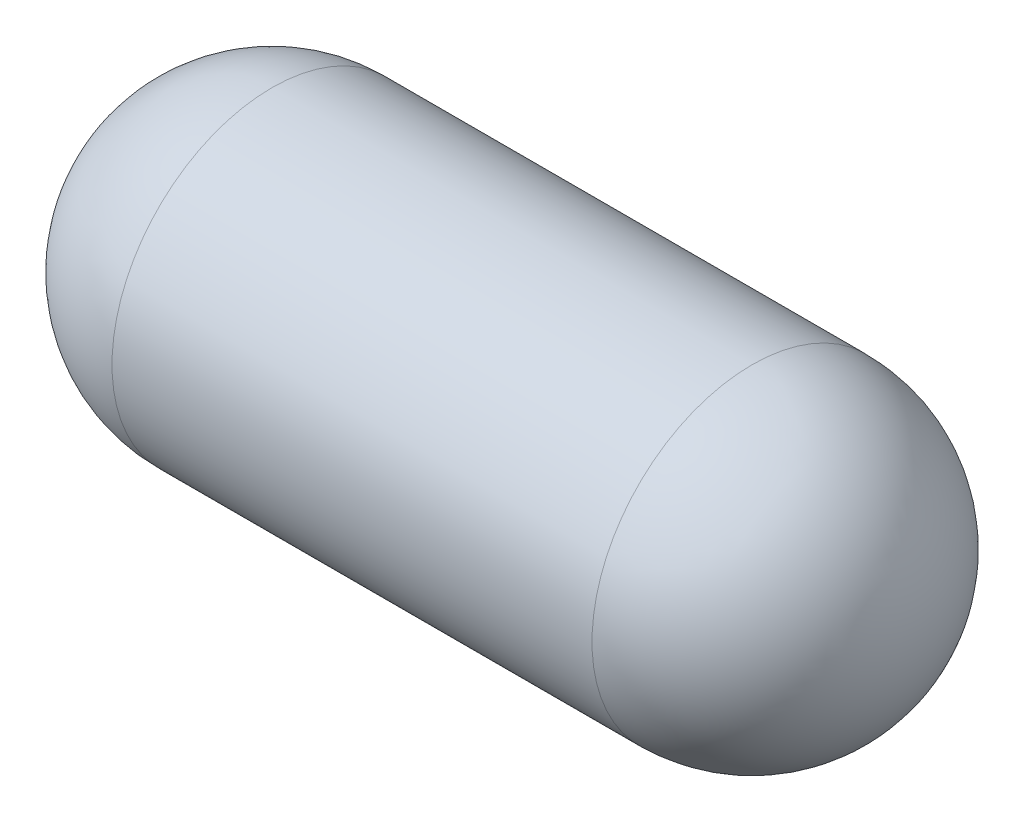
ISO-10303-21;
HEADER;
FILE_DESCRIPTION(('STEP AP214'),'2;1');
FILE_NAME('part.step','',(''),(''),'','','');
FILE_SCHEMA(('AUTOMOTIVE_DESIGN { 1 0 10303 214 1 1 1 1 }'));
ENDSEC;
DATA;
#1=APPLICATION_CONTEXT('core data for automotive mechanical design processes');
#2=APPLICATION_PROTOCOL_DEFINITION('international standard','automotive_design',2000,#1);
#3=PRODUCT_CONTEXT('',#1,'mechanical');
#4=PRODUCT('Part','Part','',(#3));
#5=PRODUCT_RELATED_PRODUCT_CATEGORY('part','',(#4));
#6=PRODUCT_DEFINITION_FORMATION('','',#4);
#7=PRODUCT_DEFINITION_CONTEXT('part definition',#1,'design');
#8=PRODUCT_DEFINITION('design','',#6,#7);
#9=PRODUCT_DEFINITION_SHAPE('','',#8);
#10=(LENGTH_UNIT() NAMED_UNIT(*) SI_UNIT(.MILLI.,.METRE.));
#11=(NAMED_UNIT(*) PLANE_ANGLE_UNIT() SI_UNIT($,.RADIAN.));
#12=(NAMED_UNIT(*) SI_UNIT($,.STERADIAN.) SOLID_ANGLE_UNIT());
#13=UNCERTAINTY_MEASURE_WITH_UNIT(LENGTH_MEASURE(1.E-05),#10,'distance_accuracy_value','');
#14=(GEOMETRIC_REPRESENTATION_CONTEXT(3) GLOBAL_UNCERTAINTY_ASSIGNED_CONTEXT((#13)) GLOBAL_UNIT_ASSIGNED_CONTEXT((#10,
#11,#12)) REPRESENTATION_CONTEXT('',''));
#15=CARTESIAN_POINT('',(0.,0.,0.));
#16=DIRECTION('',(0.,0.,1.));
#17=DIRECTION('',(1.,0.,0.));
#18=AXIS2_PLACEMENT_3D('',#15,#16,#17);
#19=CARTESIAN_POINT('',(-7.5,0.,0.));
#20=DIRECTION('',(-1.,0.,0.));
#21=DIRECTION('',(0.,1.,0.));
#22=AXIS2_PLACEMENT_3D('',#19,#20,#21);
#23=SPHERICAL_SURFACE('',#22,5.);
#24=CARTESIAN_POINT('',(-7.5,0.,0.));
#25=DIRECTION('',(-1.,0.,0.));
#26=DIRECTION('',(0.,-1.,0.));
#27=AXIS2_PLACEMENT_3D('',#24,#25,#26);
#28=CIRCLE('',#27,5.);
#29=CARTESIAN_POINT('',(-7.5,-5.,0.));
#30=VERTEX_POINT('',#29);
#31=EDGE_CURVE('E11',#30,#30,#28,.T.);
#32=ORIENTED_EDGE('',*,*,#31,.T.);
#33=EDGE_LOOP('',(#32));
#34=FACE_BOUND('',#33,.T.);
#35=ADVANCED_FACE('F44',(#34),#23,.T.);
#36=CARTESIAN_POINT('',(-12.5,0.,0.));
#37=DIRECTION('',(-1.,0.,0.));
#38=DIRECTION('',(0.,-1.,0.));
#39=AXIS2_PLACEMENT_3D('',#36,#37,#38);
#40=CYLINDRICAL_SURFACE('',#39,5.);
#41=ORIENTED_EDGE('',*,*,#31,.F.);
#42=EDGE_LOOP('',(#41));
#43=FACE_BOUND('',#42,.T.);
#44=CARTESIAN_POINT('',(7.5,0.,0.));
#45=DIRECTION('',(-1.,0.,0.));
#46=DIRECTION('',(0.,-1.,0.));
#47=AXIS2_PLACEMENT_3D('',#44,#45,#46);
#48=CIRCLE('',#47,5.);
#49=CARTESIAN_POINT('',(7.5,-5.,0.));
#50=VERTEX_POINT('',#49);
#51=EDGE_CURVE('E53',#50,#50,#48,.T.);
#52=ORIENTED_EDGE('',*,*,#51,.T.);
#53=EDGE_LOOP('',(#52));
#54=FACE_BOUND('',#53,.T.);
#55=ADVANCED_FACE('F136',(#43,#54),#40,.T.);
#56=CARTESIAN_POINT('',(7.5,0.,0.));
#57=DIRECTION('',(-1.,0.,0.));
#58=DIRECTION('',(0.,-1.,0.));
#59=AXIS2_PLACEMENT_3D('',#56,#57,#58);
#60=SPHERICAL_SURFACE('',#59,5.);
#61=ORIENTED_EDGE('',*,*,#51,.F.);
#62=EDGE_LOOP('',(#61));
#63=FACE_BOUND('',#62,.T.);
#64=ADVANCED_FACE('F138',(#63),#60,.T.);
#65=CLOSED_SHELL('',(#35,#55,#64));
#66=CARTESIAN_POINT('',(9.525,-3.175,3.175));
#67=DIRECTION('',(-1.,0.,0.));
#68=DIRECTION('',(0.,0.,1.));
#69=AXIS2_PLACEMENT_3D('',#66,#67,#68);
#70=PLANE('',#69);
#71=DIRECTION('',(0.,1.,0.));
#72=VECTOR('',#71,1.);
#73=CARTESIAN_POINT('',(9.525,-3.175,-3.175));
#74=LINE('',#73,#72);
#75=CARTESIAN_POINT('',(9.525,-3.175,-3.175));
#76=VERTEX_POINT('',#75);
#77=CARTESIAN_POINT('',(9.525,3.175,-3.175));
#78=VERTEX_POINT('',#77);
#79=EDGE_CURVE('E117',#76,#78,#74,.T.);
#80=ORIENTED_EDGE('',*,*,#79,.F.);
#81=DIRECTION('',(0.,0.,-1.));
#82=VECTOR('',#81,1.);
#83=CARTESIAN_POINT('',(9.525,-3.175,3.175));
#84=LINE('',#83,#82);
#85=CARTESIAN_POINT('',(9.525,-3.175,3.175));
#86=VERTEX_POINT('',#85);
#87=EDGE_CURVE('E113',#86,#76,#84,.T.);
#88=ORIENTED_EDGE('',*,*,#87,.F.);
#89=DIRECTION('',(0.,1.,0.));
#90=VECTOR('',#89,1.);
#91=CARTESIAN_POINT('',(9.525,-3.175,3.175));
#92=LINE('',#91,#90);
#93=CARTESIAN_POINT('',(9.525,3.175,3.175));
#94=VERTEX_POINT('',#93);
#95=EDGE_CURVE('E102',#86,#94,#92,.T.);
#96=ORIENTED_EDGE('',*,*,#95,.T.);
#97=DIRECTION('',(0.,0.,-1.));
#98=VECTOR('',#97,1.);
#99=CARTESIAN_POINT('',(9.525,3.175,3.175));
#100=LINE('',#99,#98);
#101=EDGE_CURVE('E99',#94,#78,#100,.T.);
#102=ORIENTED_EDGE('',*,*,#101,.T.);
#103=EDGE_LOOP('',(#80,#88,#96,#102));
#104=FACE_BOUND('',#103,.T.);
#105=ADVANCED_FACE('F172',(#104),#70,.T.);
#106=CARTESIAN_POINT('',(-9.525,3.175,3.175));
#107=DIRECTION('',(0.,-1.,0.));
#108=DIRECTION('',(0.,0.,-1.));
#109=AXIS2_PLACEMENT_3D('',#106,#107,#108);
#110=PLANE('',#109);
#111=DIRECTION('',(-1.,0.,0.));
#112=VECTOR('',#111,1.);
#113=CARTESIAN_POINT('',(-9.525,3.175,-3.175));
#114=LINE('',#113,#112);
#115=CARTESIAN_POINT('',(-9.525,3.175,-3.175));
#116=VERTEX_POINT('',#115);
#117=EDGE_CURVE('E120',#78,#116,#114,.T.);
#118=ORIENTED_EDGE('',*,*,#117,.F.);
#119=ORIENTED_EDGE('',*,*,#101,.F.);
#120=DIRECTION('',(-1.,0.,0.));
#121=VECTOR('',#120,1.);
#122=CARTESIAN_POINT('',(-9.525,3.175,3.175));
#123=LINE('',#122,#121);
#124=CARTESIAN_POINT('',(-9.525,3.175,3.175));
#125=VERTEX_POINT('',#124);
#126=EDGE_CURVE('E90',#94,#125,#123,.T.);
#127=ORIENTED_EDGE('',*,*,#126,.T.);
#128=DIRECTION('',(0.,0.,-1.));
#129=VECTOR('',#128,1.);
#130=CARTESIAN_POINT('',(-9.525,3.175,3.175));
#131=LINE('',#130,#129);
#132=EDGE_CURVE('E97',#125,#116,#131,.T.);
#133=ORIENTED_EDGE('',*,*,#132,.T.);
#134=EDGE_LOOP('',(#118,#119,#127,#133));
#135=FACE_BOUND('',#134,.T.);
#136=ADVANCED_FACE('F96',(#135),#110,.T.);
#137=CARTESIAN_POINT('',(-9.525,-3.175,3.175));
#138=DIRECTION('',(1.,0.,0.));
#139=DIRECTION('',(0.,0.,-1.));
#140=AXIS2_PLACEMENT_3D('',#137,#138,#139);
#141=PLANE('',#140);
#142=DIRECTION('',(0.,-1.,0.));
#143=VECTOR('',#142,1.);
#144=CARTESIAN_POINT('',(-9.525,-3.175,-3.175));
#145=LINE('',#144,#143);
#146=CARTESIAN_POINT('',(-9.525,-3.175,-3.175));
#147=VERTEX_POINT('',#146);
#148=EDGE_CURVE('E78',#116,#147,#145,.T.);
#149=ORIENTED_EDGE('',*,*,#148,.F.);
#150=ORIENTED_EDGE('',*,*,#132,.F.);
#151=DIRECTION('',(0.,-1.,0.));
#152=VECTOR('',#151,1.);
#153=CARTESIAN_POINT('',(-9.525,-3.175,3.175));
#154=LINE('',#153,#152);
#155=CARTESIAN_POINT('',(-9.525,-3.175,3.175));
#156=VERTEX_POINT('',#155);
#157=EDGE_CURVE('E101',#125,#156,#154,.T.);
#158=ORIENTED_EDGE('',*,*,#157,.T.);
#159=DIRECTION('',(0.,0.,-1.));
#160=VECTOR('',#159,1.);
#161=CARTESIAN_POINT('',(-9.525,-3.175,3.175));
#162=LINE('',#161,#160);
#163=EDGE_CURVE('E107',#156,#147,#162,.T.);
#164=ORIENTED_EDGE('',*,*,#163,.T.);
#165=EDGE_LOOP('',(#149,#150,#158,#164));
#166=FACE_BOUND('',#165,.T.);
#167=ADVANCED_FACE('F105',(#166),#141,.T.);
#168=CARTESIAN_POINT('',(-9.525,-3.175,3.175));
#169=DIRECTION('',(0.,1.,0.));
#170=DIRECTION('',(0.,0.,1.));
#171=AXIS2_PLACEMENT_3D('',#168,#169,#170);
#172=PLANE('',#171);
#173=DIRECTION('',(1.,0.,0.));
#174=VECTOR('',#173,1.);
#175=CARTESIAN_POINT('',(-9.525,-3.175,-3.175));
#176=LINE('',#175,#174);
#177=EDGE_CURVE('E83',#147,#76,#176,.T.);
#178=ORIENTED_EDGE('',*,*,#177,.F.);
#179=ORIENTED_EDGE('',*,*,#163,.F.);
#180=DIRECTION('',(1.,0.,0.));
#181=VECTOR('',#180,1.);
#182=CARTESIAN_POINT('',(-9.525,-3.175,3.175));
#183=LINE('',#182,#181);
#184=EDGE_CURVE('E61',#156,#86,#183,.T.);
#185=ORIENTED_EDGE('',*,*,#184,.T.);
#186=ORIENTED_EDGE('',*,*,#87,.T.);
#187=EDGE_LOOP('',(#178,#179,#185,#186));
#188=FACE_BOUND('',#187,.T.);
#189=ADVANCED_FACE('F193',(#188),#172,.T.);
#190=CARTESIAN_POINT('',(0.,0.,3.175));
#191=DIRECTION('',(0.,0.,-1.));
#192=DIRECTION('',(-1.,0.,0.));
#193=AXIS2_PLACEMENT_3D('',#190,#191,#192);
#194=PLANE('',#193);
#195=ORIENTED_EDGE('',*,*,#95,.F.);
#196=ORIENTED_EDGE('',*,*,#184,.F.);
#197=ORIENTED_EDGE('',*,*,#157,.F.);
#198=ORIENTED_EDGE('',*,*,#126,.F.);
#199=EDGE_LOOP('',(#195,#196,#197,#198));
#200=FACE_BOUND('',#199,.T.);
#201=ADVANCED_FACE('F109',(#200),#194,.T.);
#202=CARTESIAN_POINT('',(0.,0.,-3.175));
#203=DIRECTION('',(0.,0.,-1.));
#204=DIRECTION('',(-1.,0.,0.));
#205=AXIS2_PLACEMENT_3D('',#202,#203,#204);
#206=PLANE('',#205);
#207=ORIENTED_EDGE('',*,*,#79,.T.);
#208=ORIENTED_EDGE('',*,*,#117,.T.);
#209=ORIENTED_EDGE('',*,*,#148,.T.);
#210=ORIENTED_EDGE('',*,*,#177,.T.);
#211=EDGE_LOOP('',(#207,#208,#209,#210));
#212=FACE_BOUND('',#211,.T.);
#213=ADVANCED_FACE('F157',(#212),#206,.F.);
#214=CLOSED_SHELL('',(#105,#136,#167,#189,#201,#213));
#215=ORIENTED_CLOSED_SHELL('',*,#65,.T.);
#216=BREP_WITH_VOIDS('B2',#214,(#215));
#217=ADVANCED_BREP_SHAPE_REPRESENTATION('',(#18,#216),#14);
#218=SHAPE_DEFINITION_REPRESENTATION(#9,#217);
ENDSEC;
END-ISO-10303-21;
